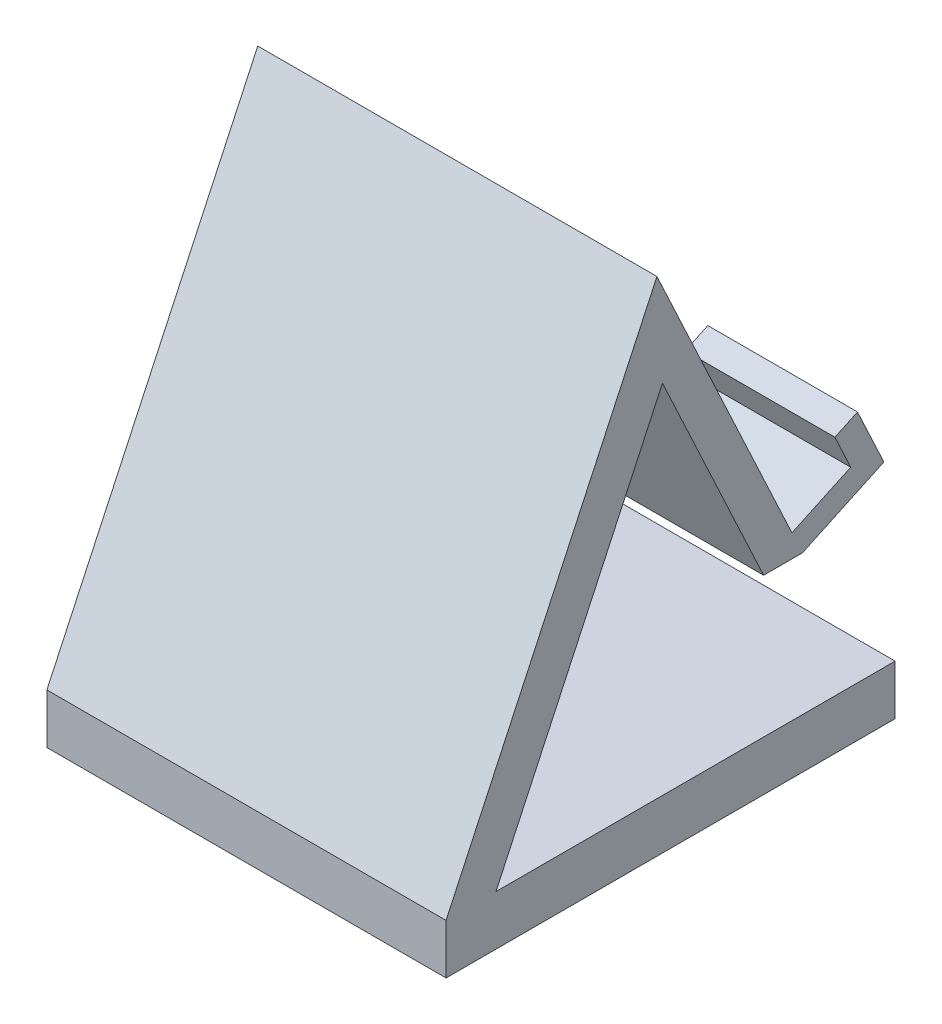
ISO-10303-21;
HEADER;
FILE_DESCRIPTION(('STEP AP214'),'2;1');
FILE_NAME('part.step','',(''),(''),'','','');
FILE_SCHEMA(('AUTOMOTIVE_DESIGN { 1 0 10303 214 1 1 1 1 }'));
ENDSEC;
DATA;
#1=APPLICATION_CONTEXT('core data for automotive mechanical design processes');
#2=APPLICATION_PROTOCOL_DEFINITION('international standard','automotive_design',2000,#1);
#3=PRODUCT_CONTEXT('',#1,'mechanical');
#4=PRODUCT('Part','Part','',(#3));
#5=PRODUCT_RELATED_PRODUCT_CATEGORY('part','',(#4));
#6=PRODUCT_DEFINITION_FORMATION('','',#4);
#7=PRODUCT_DEFINITION_CONTEXT('part definition',#1,'design');
#8=PRODUCT_DEFINITION('design','',#6,#7);
#9=PRODUCT_DEFINITION_SHAPE('','',#8);
#10=(LENGTH_UNIT() NAMED_UNIT(*) SI_UNIT(.MILLI.,.METRE.));
#11=(NAMED_UNIT(*) PLANE_ANGLE_UNIT() SI_UNIT($,.RADIAN.));
#12=(NAMED_UNIT(*) SI_UNIT($,.STERADIAN.) SOLID_ANGLE_UNIT());
#13=UNCERTAINTY_MEASURE_WITH_UNIT(LENGTH_MEASURE(1.E-05),#10,'distance_accuracy_value','');
#14=(GEOMETRIC_REPRESENTATION_CONTEXT(3) GLOBAL_UNCERTAINTY_ASSIGNED_CONTEXT((#13)) GLOBAL_UNIT_ASSIGNED_CONTEXT((#10,
#11,#12)) REPRESENTATION_CONTEXT('',''));
#15=CARTESIAN_POINT('',(0.,0.,0.));
#16=DIRECTION('',(0.,0.,1.));
#17=DIRECTION('',(1.,0.,0.));
#18=AXIS2_PLACEMENT_3D('',#15,#16,#17);
#19=CARTESIAN_POINT('',(80.,100.630778703665,-42.2618261740697));
#20=DIRECTION('',(0.,-0.422618261740698,0.906307787036651));
#21=DIRECTION('',(0.,-0.906307787036651,-0.422618261740698));
#22=AXIS2_PLACEMENT_3D('',#19,#20,#21);
#23=PLANE('',#22);
#24=DIRECTION('',(1.,0.,0.));
#25=VECTOR('',#24,1.);
#26=CARTESIAN_POINT('',(0.,42.6067091621437,-69.3188941585993));
#27=LINE('',#26,#25);
#28=CARTESIAN_POINT('',(0.,42.6067091621437,-69.3188941585993));
#29=VERTEX_POINT('',#28);
#30=CARTESIAN_POINT('',(30.,42.6067091621437,-69.3188941585993));
#31=VERTEX_POINT('',#30);
#32=EDGE_CURVE('E260',#29,#31,#27,.T.);
#33=ORIENTED_EDGE('',*,*,#32,.F.);
#34=DIRECTION('',(0.,0.90630778703665,0.422618261740698));
#35=VECTOR('',#34,1.);
#36=CARTESIAN_POINT('',(0.,100.630778703665,-42.2618261740697));
#37=LINE('',#36,#35);
#38=CARTESIAN_POINT('',(0.,100.630778703665,-42.2618261740697));
#39=VERTEX_POINT('',#38);
#40=EDGE_CURVE('E357',#29,#39,#37,.T.);
#41=ORIENTED_EDGE('',*,*,#40,.T.);
#42=DIRECTION('',(-1.,0.,0.));
#43=VECTOR('',#42,1.);
#44=CARTESIAN_POINT('',(80.,100.630778703665,-42.2618261740697));
#45=LINE('',#44,#43);
#46=CARTESIAN_POINT('',(80.,100.630778703665,-42.2618261740697));
#47=VERTEX_POINT('',#46);
#48=EDGE_CURVE('E365',#47,#39,#45,.T.);
#49=ORIENTED_EDGE('',*,*,#48,.F.);
#50=DIRECTION('',(0.,0.906307787036651,0.422618261740697));
#51=VECTOR('',#50,1.);
#52=CARTESIAN_POINT('',(80.,92.4536374491595,-46.0748897628608));
#53=LINE('',#52,#51);
#54=CARTESIAN_POINT('',(80.,42.6067091621437,-69.3188941585992));
#55=VERTEX_POINT('',#54);
#56=EDGE_CURVE('E329',#55,#47,#53,.T.);
#57=ORIENTED_EDGE('',*,*,#56,.F.);
#58=DIRECTION('',(1.,0.,0.));
#59=VECTOR('',#58,1.);
#60=CARTESIAN_POINT('',(80.,42.6067091621437,-69.3188941585993));
#61=LINE('',#60,#59);
#62=CARTESIAN_POINT('',(50.,42.6067091621437,-69.3188941585993));
#63=VERTEX_POINT('',#62);
#64=EDGE_CURVE('E285',#63,#55,#61,.T.);
#65=ORIENTED_EDGE('',*,*,#64,.F.);
#66=DIRECTION('',(0.,0.906307787036651,0.422618261740698));
#67=VECTOR('',#66,1.);
#68=CARTESIAN_POINT('',(50.,38.0751702269605,-71.4319854673028));
#69=LINE('',#68,#67);
#70=CARTESIAN_POINT('',(50.,38.0751702269605,-71.4319854673028));
#71=VERTEX_POINT('',#70);
#72=EDGE_CURVE('E279',#71,#63,#69,.T.);
#73=ORIENTED_EDGE('',*,*,#72,.F.);
#74=DIRECTION('',(-1.,0.,0.));
#75=VECTOR('',#74,1.);
#76=CARTESIAN_POINT('',(80.,38.0751702269604,-71.4319854673026));
#77=LINE('',#76,#75);
#78=CARTESIAN_POINT('',(30.,38.0751702269604,-71.4319854673026));
#79=VERTEX_POINT('',#78);
#80=EDGE_CURVE('E369',#71,#79,#77,.T.);
#81=ORIENTED_EDGE('',*,*,#80,.T.);
#82=DIRECTION('',(0.,-0.90630778703665,-0.422618261740698));
#83=VECTOR('',#82,1.);
#84=CARTESIAN_POINT('',(30.,38.0751702269605,-71.4319854673028));
#85=LINE('',#84,#83);
#86=EDGE_CURVE('E55',#31,#79,#85,.T.);
#87=ORIENTED_EDGE('',*,*,#86,.F.);
#88=EDGE_LOOP('',(#33,#41,#49,#57,#65,#73,#81,#87));
#89=FACE_BOUND('',#88,.T.);
#90=ADVANCED_FACE('F39',(#89),#23,.F.);
#91=CARTESIAN_POINT('',(80.,0.,0.));
#92=DIRECTION('',(0.,0.,-1.));
#93=DIRECTION('',(-1.,0.,0.));
#94=AXIS2_PLACEMENT_3D('',#91,#92,#93);
#95=PLANE('',#94);
#96=DIRECTION('',(0.,-1.,0.));
#97=VECTOR('',#96,1.);
#98=CARTESIAN_POINT('',(0.,0.,0.));
#99=LINE('',#98,#97);
#100=CARTESIAN_POINT('',(0.,10.,0.));
#101=VERTEX_POINT('',#100);
#102=CARTESIAN_POINT('',(0.,0.,0.));
#103=VERTEX_POINT('',#102);
#104=EDGE_CURVE('E304',#101,#103,#99,.T.);
#105=ORIENTED_EDGE('',*,*,#104,.T.);
#106=DIRECTION('',(-1.,0.,0.));
#107=VECTOR('',#106,1.);
#108=CARTESIAN_POINT('',(80.,0.,0.));
#109=LINE('',#108,#107);
#110=CARTESIAN_POINT('',(80.,0.,0.));
#111=VERTEX_POINT('',#110);
#112=EDGE_CURVE('E11',#111,#103,#109,.T.);
#113=ORIENTED_EDGE('',*,*,#112,.F.);
#114=DIRECTION('',(0.,-1.,0.));
#115=VECTOR('',#114,1.);
#116=CARTESIAN_POINT('',(80.,0.,0.));
#117=LINE('',#116,#115);
#118=CARTESIAN_POINT('',(80.,10.,0.));
#119=VERTEX_POINT('',#118);
#120=EDGE_CURVE('E305',#119,#111,#117,.T.);
#121=ORIENTED_EDGE('',*,*,#120,.F.);
#122=DIRECTION('',(-1.,0.,0.));
#123=VECTOR('',#122,1.);
#124=CARTESIAN_POINT('',(80.,10.,0.));
#125=LINE('',#124,#123);
#126=EDGE_CURVE('E335',#119,#101,#125,.T.);
#127=ORIENTED_EDGE('',*,*,#126,.T.);
#128=EDGE_LOOP('',(#105,#113,#121,#127));
#129=FACE_BOUND('',#128,.T.);
#130=ADVANCED_FACE('F41',(#129),#95,.F.);
#131=CARTESIAN_POINT('',(80.,0.,0.));
#132=DIRECTION('',(0.,1.,0.));
#133=DIRECTION('',(0.,0.,1.));
#134=AXIS2_PLACEMENT_3D('',#131,#132,#133);
#135=PLANE('',#134);
#136=DIRECTION('',(0.,0.,-1.));
#137=VECTOR('',#136,1.);
#138=CARTESIAN_POINT('',(0.,0.,0.));
#139=LINE('',#138,#137);
#140=CARTESIAN_POINT('',(0.,0.,-90.));
#141=VERTEX_POINT('',#140);
#142=EDGE_CURVE('E339',#103,#141,#139,.T.);
#143=ORIENTED_EDGE('',*,*,#142,.T.);
#144=DIRECTION('',(-1.,0.,0.));
#145=VECTOR('',#144,1.);
#146=CARTESIAN_POINT('',(80.,0.,-90.));
#147=LINE('',#146,#145);
#148=CARTESIAN_POINT('',(80.,0.,-90.));
#149=VERTEX_POINT('',#148);
#150=EDGE_CURVE('E48',#149,#141,#147,.T.);
#151=ORIENTED_EDGE('',*,*,#150,.F.);
#152=DIRECTION('',(0.,0.,-1.));
#153=VECTOR('',#152,1.);
#154=CARTESIAN_POINT('',(80.,0.,0.));
#155=LINE('',#154,#153);
#156=EDGE_CURVE('E309',#111,#149,#155,.T.);
#157=ORIENTED_EDGE('',*,*,#156,.F.);
#158=ORIENTED_EDGE('',*,*,#112,.T.);
#159=EDGE_LOOP('',(#143,#151,#157,#158));
#160=FACE_BOUND('',#159,.T.);
#161=ADVANCED_FACE('F417',(#160),#135,.F.);
#162=CARTESIAN_POINT('',(80.,0.,-90.));
#163=DIRECTION('',(0.,0.,1.));
#164=DIRECTION('',(1.,0.,0.));
#165=AXIS2_PLACEMENT_3D('',#162,#163,#164);
#166=PLANE('',#165);
#167=DIRECTION('',(0.,1.,0.));
#168=VECTOR('',#167,1.);
#169=CARTESIAN_POINT('',(0.,0.,-90.));
#170=LINE('',#169,#168);
#171=CARTESIAN_POINT('',(0.,10.,-90.));
#172=VERTEX_POINT('',#171);
#173=EDGE_CURVE('E342',#141,#172,#170,.T.);
#174=ORIENTED_EDGE('',*,*,#173,.T.);
#175=DIRECTION('',(-1.,0.,0.));
#176=VECTOR('',#175,1.);
#177=CARTESIAN_POINT('',(80.,10.,-90.));
#178=LINE('',#177,#176);
#179=CARTESIAN_POINT('',(80.,10.,-90.));
#180=VERTEX_POINT('',#179);
#181=EDGE_CURVE('E385',#180,#172,#178,.T.);
#182=ORIENTED_EDGE('',*,*,#181,.F.);
#183=DIRECTION('',(0.,1.,0.));
#184=VECTOR('',#183,1.);
#185=CARTESIAN_POINT('',(80.,0.,-90.));
#186=LINE('',#185,#184);
#187=EDGE_CURVE('E313',#149,#180,#186,.T.);
#188=ORIENTED_EDGE('',*,*,#187,.F.);
#189=ORIENTED_EDGE('',*,*,#150,.T.);
#190=EDGE_LOOP('',(#174,#182,#188,#189));
#191=FACE_BOUND('',#190,.T.);
#192=ADVANCED_FACE('F394',(#191),#166,.F.);
#193=CARTESIAN_POINT('',(80.,10.,-10.));
#194=DIRECTION('',(0.,-1.,0.));
#195=DIRECTION('',(0.,0.,-1.));
#196=AXIS2_PLACEMENT_3D('',#193,#194,#195);
#197=PLANE('',#196);
#198=DIRECTION('',(0.,0.,1.));
#199=VECTOR('',#198,1.);
#200=CARTESIAN_POINT('',(0.,10.,-10.));
#201=LINE('',#200,#199);
#202=CARTESIAN_POINT('',(0.,10.,-10.));
#203=VERTEX_POINT('',#202);
#204=EDGE_CURVE('E345',#172,#203,#201,.T.);
#205=ORIENTED_EDGE('',*,*,#204,.T.);
#206=DIRECTION('',(-1.,0.,0.));
#207=VECTOR('',#206,1.);
#208=CARTESIAN_POINT('',(80.,10.,-10.));
#209=LINE('',#208,#207);
#210=CARTESIAN_POINT('',(80.,10.,-10.));
#211=VERTEX_POINT('',#210);
#212=EDGE_CURVE('E381',#211,#203,#209,.T.);
#213=ORIENTED_EDGE('',*,*,#212,.F.);
#214=DIRECTION('',(0.,0.,1.));
#215=VECTOR('',#214,1.);
#216=CARTESIAN_POINT('',(80.,10.,-10.));
#217=LINE('',#216,#215);
#218=EDGE_CURVE('E316',#180,#211,#217,.T.);
#219=ORIENTED_EDGE('',*,*,#218,.F.);
#220=ORIENTED_EDGE('',*,*,#181,.T.);
#221=EDGE_LOOP('',(#205,#213,#219,#220));
#222=FACE_BOUND('',#221,.T.);
#223=ADVANCED_FACE('F405',(#222),#197,.F.);
#224=CARTESIAN_POINT('',(80.,10.,-10.));
#225=DIRECTION('',(0.,0.422618261740697,0.906307787036651));
#226=DIRECTION('',(0.,-0.906307787036651,0.422618261740697));
#227=AXIS2_PLACEMENT_3D('',#224,#225,#226);
#228=PLANE('',#227);
#229=DIRECTION('',(0.,0.906307787036651,-0.422618261740697));
#230=VECTOR('',#229,1.);
#231=CARTESIAN_POINT('',(0.,10.,-10.));
#232=LINE('',#231,#230);
#233=CARTESIAN_POINT('',(0.,81.5596823642886,-43.3688279016068));
#234=VERTEX_POINT('',#233);
#235=EDGE_CURVE('E348',#203,#234,#232,.T.);
#236=ORIENTED_EDGE('',*,*,#235,.T.);
#237=DIRECTION('',(-1.,0.,0.));
#238=VECTOR('',#237,1.);
#239=CARTESIAN_POINT('',(80.,81.5596823642886,-43.3688279016068));
#240=LINE('',#239,#238);
#241=CARTESIAN_POINT('',(80.,81.5596823642886,-43.3688279016068));
#242=VERTEX_POINT('',#241);
#243=EDGE_CURVE('E377',#242,#234,#240,.T.);
#244=ORIENTED_EDGE('',*,*,#243,.F.);
#245=DIRECTION('',(0.,0.906307787036651,-0.422618261740697));
#246=VECTOR('',#245,1.);
#247=CARTESIAN_POINT('',(80.,10.,-10.));
#248=LINE('',#247,#246);
#249=EDGE_CURVE('E319',#211,#242,#248,.T.);
#250=ORIENTED_EDGE('',*,*,#249,.F.);
#251=ORIENTED_EDGE('',*,*,#212,.T.);
#252=EDGE_LOOP('',(#236,#244,#250,#251));
#253=FACE_BOUND('',#252,.T.);
#254=ADVANCED_FACE('F409',(#253),#228,.F.);
#255=CARTESIAN_POINT('',(80.,81.5596823642886,-43.3688279016068));
#256=DIRECTION('',(0.,0.422618261740697,-0.906307787036651));
#257=DIRECTION('',(0.,0.906307787036651,0.422618261740697));
#258=AXIS2_PLACEMENT_3D('',#255,#256,#257);
#259=PLANE('',#258);
#260=DIRECTION('',(0.,-0.906307787036651,-0.422618261740697));
#261=VECTOR('',#260,1.);
#262=CARTESIAN_POINT('',(0.,81.5596823642886,-43.3688279016068));
#263=LINE('',#262,#261);
#264=CARTESIAN_POINT('',(0.,38.0751702269604,-63.6459889223767));
#265=VERTEX_POINT('',#264);
#266=EDGE_CURVE('E351',#234,#265,#263,.T.);
#267=ORIENTED_EDGE('',*,*,#266,.T.);
#268=DIRECTION('',(-1.,0.,0.));
#269=VECTOR('',#268,1.);
#270=CARTESIAN_POINT('',(80.,38.0751702269604,-63.6459889223767));
#271=LINE('',#270,#269);
#272=CARTESIAN_POINT('',(80.,38.0751702269604,-63.6459889223767));
#273=VERTEX_POINT('',#272);
#274=EDGE_CURVE('E373',#273,#265,#271,.T.);
#275=ORIENTED_EDGE('',*,*,#274,.F.);
#276=DIRECTION('',(0.,-0.906307787036651,-0.422618261740697));
#277=VECTOR('',#276,1.);
#278=CARTESIAN_POINT('',(80.,81.5596823642886,-43.3688279016068));
#279=LINE('',#278,#277);
#280=EDGE_CURVE('E322',#242,#273,#279,.T.);
#281=ORIENTED_EDGE('',*,*,#280,.F.);
#282=ORIENTED_EDGE('',*,*,#243,.T.);
#283=EDGE_LOOP('',(#267,#275,#281,#282));
#284=FACE_BOUND('',#283,.T.);
#285=ADVANCED_FACE('F461',(#284),#259,.F.);
#286=CARTESIAN_POINT('',(80.,38.0751702269604,-63.6459889223767));
#287=DIRECTION('',(0.,1.,0.));
#288=DIRECTION('',(0.,0.,1.));
#289=AXIS2_PLACEMENT_3D('',#286,#287,#288);
#290=PLANE('',#289);
#291=DIRECTION('',(0.,0.,-1.));
#292=VECTOR('',#291,1.);
#293=CARTESIAN_POINT('',(0.,38.0751702269604,-63.6459889223767));
#294=LINE('',#293,#292);
#295=CARTESIAN_POINT('',(0.,38.0751702269604,-71.4319854673026));
#296=VERTEX_POINT('',#295);
#297=EDGE_CURVE('E354',#265,#296,#294,.T.);
#298=ORIENTED_EDGE('',*,*,#297,.T.);
#299=DIRECTION('',(-1.,0.,0.));
#300=VECTOR('',#299,1.);
#301=CARTESIAN_POINT('',(0.,38.0751702269605,-71.4319854673028));
#302=LINE('',#301,#300);
#303=EDGE_CURVE('E63',#79,#296,#302,.T.);
#304=ORIENTED_EDGE('',*,*,#303,.F.);
#305=ORIENTED_EDGE('',*,*,#80,.F.);
#306=CARTESIAN_POINT('',(80.,38.0751702269605,-71.4319854673028));
#307=VERTEX_POINT('',#306);
#308=EDGE_CURVE('E370',#307,#71,#77,.T.);
#309=ORIENTED_EDGE('',*,*,#308,.F.);
#310=DIRECTION('',(0.,0.,-1.));
#311=VECTOR('',#310,1.);
#312=CARTESIAN_POINT('',(80.,38.0751702269604,-63.6459889223767));
#313=LINE('',#312,#311);
#314=EDGE_CURVE('E325',#273,#307,#313,.T.);
#315=ORIENTED_EDGE('',*,*,#314,.F.);
#316=ORIENTED_EDGE('',*,*,#274,.T.);
#317=EDGE_LOOP('',(#298,#304,#305,#309,#315,#316));
#318=FACE_BOUND('',#317,.T.);
#319=ADVANCED_FACE('F458',(#318),#290,.F.);
#320=CARTESIAN_POINT('',(80.,10.,0.));
#321=DIRECTION('',(0.,-0.422618261740697,-0.906307787036651));
#322=DIRECTION('',(0.,0.906307787036651,-0.422618261740697));
#323=AXIS2_PLACEMENT_3D('',#320,#321,#322);
#324=PLANE('',#323);
#325=DIRECTION('',(0.,-0.906307787036651,0.422618261740697));
#326=VECTOR('',#325,1.);
#327=CARTESIAN_POINT('',(0.,10.,0.));
#328=LINE('',#327,#326);
#329=EDGE_CURVE('E310',#39,#101,#328,.T.);
#330=ORIENTED_EDGE('',*,*,#329,.T.);
#331=ORIENTED_EDGE('',*,*,#126,.F.);
#332=DIRECTION('',(0.,-0.906307787036651,0.422618261740697));
#333=VECTOR('',#332,1.);
#334=CARTESIAN_POINT('',(80.,10.,0.));
#335=LINE('',#334,#333);
#336=EDGE_CURVE('E332',#47,#119,#335,.T.);
#337=ORIENTED_EDGE('',*,*,#336,.F.);
#338=ORIENTED_EDGE('',*,*,#48,.T.);
#339=EDGE_LOOP('',(#330,#331,#337,#338));
#340=FACE_BOUND('',#339,.T.);
#341=ADVANCED_FACE('F422',(#340),#324,.F.);
#342=CARTESIAN_POINT('',(80.,0.,0.));
#343=DIRECTION('',(-1.,0.,0.));
#344=DIRECTION('',(0.,0.,1.));
#345=AXIS2_PLACEMENT_3D('',#342,#343,#344);
#346=PLANE('',#345);
#347=ORIENTED_EDGE('',*,*,#120,.T.);
#348=ORIENTED_EDGE('',*,*,#156,.T.);
#349=ORIENTED_EDGE('',*,*,#187,.T.);
#350=ORIENTED_EDGE('',*,*,#218,.T.);
#351=ORIENTED_EDGE('',*,*,#249,.T.);
#352=ORIENTED_EDGE('',*,*,#280,.T.);
#353=ORIENTED_EDGE('',*,*,#314,.T.);
#354=DIRECTION('',(0.,-0.422618261740698,0.906307787036651));
#355=VECTOR('',#354,1.);
#356=CARTESIAN_POINT('',(80.,43.5692076295895,-83.2139866987792));
#357=LINE('',#356,#355);
#358=CARTESIAN_POINT('',(80.,45.6822989382931,-87.7455256339625));
#359=VERTEX_POINT('',#358);
#360=EDGE_CURVE('E301',#359,#307,#357,.T.);
#361=ORIENTED_EDGE('',*,*,#360,.F.);
#362=DIRECTION('',(0.,-0.906307787036651,-0.422618261740697));
#363=VECTOR('',#362,1.);
#364=CARTESIAN_POINT('',(80.,45.6822989382931,-87.7455256339625));
#365=LINE('',#364,#363);
#366=CARTESIAN_POINT('',(80.,57.0111462762512,-82.4627973622038));
#367=VERTEX_POINT('',#366);
#368=EDGE_CURVE('E229',#367,#359,#365,.T.);
#369=ORIENTED_EDGE('',*,*,#368,.F.);
#370=DIRECTION('',(0.,-0.422618261740698,0.906307787036651));
#371=VECTOR('',#370,1.);
#372=CARTESIAN_POINT('',(80.,57.0111462762512,-82.4627973622038));
#373=LINE('',#372,#371);
#374=CARTESIAN_POINT('',(80.,54.8980549675477,-77.9312584270205));
#375=VERTEX_POINT('',#374);
#376=EDGE_CURVE('E244',#367,#375,#373,.T.);
#377=ORIENTED_EDGE('',*,*,#376,.T.);
#378=DIRECTION('',(0.,-0.906307787036651,-0.422618261740697));
#379=VECTOR('',#378,1.);
#380=CARTESIAN_POINT('',(80.,43.5692076295896,-83.2139866987792));
#381=LINE('',#380,#379);
#382=CARTESIAN_POINT('',(80.,48.1007465647728,-81.1008953900757));
#383=VERTEX_POINT('',#382);
#384=EDGE_CURVE('E228',#375,#383,#381,.T.);
#385=ORIENTED_EDGE('',*,*,#384,.T.);
#386=DIRECTION('',(0.,-0.422618261740698,0.906307787036651));
#387=VECTOR('',#386,1.);
#388=CARTESIAN_POINT('',(80.,48.1007465647728,-81.1008953900757));
#389=LINE('',#388,#387);
#390=EDGE_CURVE('E284',#383,#55,#389,.T.);
#391=ORIENTED_EDGE('',*,*,#390,.T.);
#392=ORIENTED_EDGE('',*,*,#56,.T.);
#393=ORIENTED_EDGE('',*,*,#336,.T.);
#394=EDGE_LOOP('',(#347,#348,#349,#350,#351,#352,#353,#361,#369,#377,#385,#391,#392,#393));
#395=FACE_BOUND('',#394,.T.);
#396=ADVANCED_FACE('F413',(#395),#346,.F.);
#397=CARTESIAN_POINT('',(0.,0.,0.));
#398=DIRECTION('',(-1.,0.,0.));
#399=DIRECTION('',(0.,0.,1.));
#400=AXIS2_PLACEMENT_3D('',#397,#398,#399);
#401=PLANE('',#400);
#402=ORIENTED_EDGE('',*,*,#104,.F.);
#403=ORIENTED_EDGE('',*,*,#329,.F.);
#404=ORIENTED_EDGE('',*,*,#40,.F.);
#405=DIRECTION('',(0.,-0.422618261740698,0.906307787036651));
#406=VECTOR('',#405,1.);
#407=CARTESIAN_POINT('',(0.,48.1007465647728,-81.1008953900757));
#408=LINE('',#407,#406);
#409=CARTESIAN_POINT('',(0.,48.1007465647728,-81.1008953900757));
#410=VERTEX_POINT('',#409);
#411=EDGE_CURVE('E275',#410,#29,#408,.T.);
#412=ORIENTED_EDGE('',*,*,#411,.F.);
#413=DIRECTION('',(0.,0.906307787036651,0.422618261740697));
#414=VECTOR('',#413,1.);
#415=CARTESIAN_POINT('',(0.,43.5692076295896,-83.2139866987792));
#416=LINE('',#415,#414);
#417=CARTESIAN_POINT('',(0.,54.8980549675477,-77.9312584270205));
#418=VERTEX_POINT('',#417);
#419=EDGE_CURVE('E208',#410,#418,#416,.T.);
#420=ORIENTED_EDGE('',*,*,#419,.T.);
#421=DIRECTION('',(0.,-0.422618261740698,0.906307787036651));
#422=VECTOR('',#421,1.);
#423=CARTESIAN_POINT('',(0.,57.0111462762512,-82.4627973622038));
#424=LINE('',#423,#422);
#425=CARTESIAN_POINT('',(0.,57.0111462762512,-82.4627973622038));
#426=VERTEX_POINT('',#425);
#427=EDGE_CURVE('E224',#426,#418,#424,.T.);
#428=ORIENTED_EDGE('',*,*,#427,.F.);
#429=DIRECTION('',(0.,0.906307787036651,0.422618261740697));
#430=VECTOR('',#429,1.);
#431=CARTESIAN_POINT('',(0.,45.6822989382931,-87.7455256339625));
#432=LINE('',#431,#430);
#433=CARTESIAN_POINT('',(0.,45.6822989382931,-87.7455256339625));
#434=VERTEX_POINT('',#433);
#435=EDGE_CURVE('E198',#434,#426,#432,.T.);
#436=ORIENTED_EDGE('',*,*,#435,.F.);
#437=DIRECTION('',(0.,-0.422618261740698,0.906307787036651));
#438=VECTOR('',#437,1.);
#439=CARTESIAN_POINT('',(0.,43.5692076295895,-83.2139866987792));
#440=LINE('',#439,#438);
#441=EDGE_CURVE('E189',#434,#296,#440,.T.);
#442=ORIENTED_EDGE('',*,*,#441,.T.);
#443=ORIENTED_EDGE('',*,*,#297,.F.);
#444=ORIENTED_EDGE('',*,*,#266,.F.);
#445=ORIENTED_EDGE('',*,*,#235,.F.);
#446=ORIENTED_EDGE('',*,*,#204,.F.);
#447=ORIENTED_EDGE('',*,*,#173,.F.);
#448=ORIENTED_EDGE('',*,*,#142,.F.);
#449=EDGE_LOOP('',(#402,#403,#404,#412,#420,#428,#436,#442,#443,#444,#445,#446,#447,#448));
#450=FACE_BOUND('',#449,.T.);
#451=ADVANCED_FACE('F400',(#450),#401,.T.);
#452=CARTESIAN_POINT('',(80.,43.5692076295895,-83.2139866987792));
#453=DIRECTION('',(0.,0.906307787036651,0.422618261740698));
#454=DIRECTION('',(0.,-0.422618261740698,0.906307787036651));
#455=AXIS2_PLACEMENT_3D('',#452,#453,#454);
#456=PLANE('',#455);
#457=ORIENTED_EDGE('',*,*,#308,.T.);
#458=DIRECTION('',(0.,-0.422618261740698,0.906307787036651));
#459=VECTOR('',#458,1.);
#460=CARTESIAN_POINT('',(50.,43.5692076295895,-83.2139866987792));
#461=LINE('',#460,#459);
#462=CARTESIAN_POINT('',(50.,45.6822989382931,-87.7455256339625));
#463=VERTEX_POINT('',#462);
#464=EDGE_CURVE('E297',#463,#71,#461,.T.);
#465=ORIENTED_EDGE('',*,*,#464,.F.);
#466=DIRECTION('',(-1.,0.,0.));
#467=VECTOR('',#466,1.);
#468=CARTESIAN_POINT('',(80.,45.6822989382931,-87.7455256339625));
#469=LINE('',#468,#467);
#470=EDGE_CURVE('E233',#359,#463,#469,.T.);
#471=ORIENTED_EDGE('',*,*,#470,.F.);
#472=ORIENTED_EDGE('',*,*,#360,.T.);
#473=EDGE_LOOP('',(#457,#465,#471,#472));
#474=FACE_BOUND('',#473,.T.);
#475=ADVANCED_FACE('F512',(#474),#456,.F.);
#476=CARTESIAN_POINT('',(50.,43.5692076295895,-83.2139866987792));
#477=DIRECTION('',(1.,0.,0.));
#478=DIRECTION('',(0.,0.,-1.));
#479=AXIS2_PLACEMENT_3D('',#476,#477,#478);
#480=PLANE('',#479);
#481=ORIENTED_EDGE('',*,*,#72,.T.);
#482=DIRECTION('',(0.,-0.422618261740698,0.906307787036651));
#483=VECTOR('',#482,1.);
#484=CARTESIAN_POINT('',(50.,48.1007465647728,-81.1008953900757));
#485=LINE('',#484,#483);
#486=CARTESIAN_POINT('',(50.,48.1007465647728,-81.1008953900757));
#487=VERTEX_POINT('',#486);
#488=EDGE_CURVE('E293',#487,#63,#485,.T.);
#489=ORIENTED_EDGE('',*,*,#488,.F.);
#490=DIRECTION('',(0.,0.906307787036651,0.422618261740697));
#491=VECTOR('',#490,1.);
#492=CARTESIAN_POINT('',(50.,43.5692076295896,-83.2139866987792));
#493=LINE('',#492,#491);
#494=CARTESIAN_POINT('',(50.,54.8980549675477,-77.9312584270205));
#495=VERTEX_POINT('',#494);
#496=EDGE_CURVE('E248',#487,#495,#493,.T.);
#497=ORIENTED_EDGE('',*,*,#496,.T.);
#498=DIRECTION('',(0.,-0.422618261740698,0.906307787036651));
#499=VECTOR('',#498,1.);
#500=CARTESIAN_POINT('',(50.,57.0111462762512,-82.4627973622038));
#501=LINE('',#500,#499);
#502=CARTESIAN_POINT('',(50.,57.0111462762512,-82.4627973622038));
#503=VERTEX_POINT('',#502);
#504=EDGE_CURVE('E256',#503,#495,#501,.T.);
#505=ORIENTED_EDGE('',*,*,#504,.F.);
#506=DIRECTION('',(0.,0.906307787036651,0.422618261740697));
#507=VECTOR('',#506,1.);
#508=CARTESIAN_POINT('',(50.,45.6822989382931,-87.7455256339625));
#509=LINE('',#508,#507);
#510=EDGE_CURVE('E238',#463,#503,#509,.T.);
#511=ORIENTED_EDGE('',*,*,#510,.F.);
#512=ORIENTED_EDGE('',*,*,#464,.T.);
#513=EDGE_LOOP('',(#481,#489,#497,#505,#511,#512));
#514=FACE_BOUND('',#513,.T.);
#515=ADVANCED_FACE('F518',(#514),#480,.F.);
#516=CARTESIAN_POINT('',(80.,48.1007465647728,-81.1008953900757));
#517=DIRECTION('',(0.,-0.906307787036651,-0.422618261740698));
#518=DIRECTION('',(0.,0.422618261740698,-0.906307787036651));
#519=AXIS2_PLACEMENT_3D('',#516,#517,#518);
#520=PLANE('',#519);
#521=ORIENTED_EDGE('',*,*,#64,.T.);
#522=ORIENTED_EDGE('',*,*,#390,.F.);
#523=DIRECTION('',(1.,0.,0.));
#524=VECTOR('',#523,1.);
#525=CARTESIAN_POINT('',(80.,48.1007465647728,-81.1008953900757));
#526=LINE('',#525,#524);
#527=EDGE_CURVE('E280',#487,#383,#526,.T.);
#528=ORIENTED_EDGE('',*,*,#527,.F.);
#529=ORIENTED_EDGE('',*,*,#488,.T.);
#530=EDGE_LOOP('',(#521,#522,#528,#529));
#531=FACE_BOUND('',#530,.T.);
#532=ADVANCED_FACE('F526',(#531),#520,.F.);
#533=CARTESIAN_POINT('',(0.,48.1007465647728,-81.1008953900757));
#534=DIRECTION('',(0.,-0.906307787036651,-0.422618261740698));
#535=DIRECTION('',(0.,0.422618261740698,-0.906307787036651));
#536=AXIS2_PLACEMENT_3D('',#533,#534,#535);
#537=PLANE('',#536);
#538=ORIENTED_EDGE('',*,*,#32,.T.);
#539=DIRECTION('',(0.,-0.422618261740698,0.906307787036651));
#540=VECTOR('',#539,1.);
#541=CARTESIAN_POINT('',(30.,48.1007465647728,-81.1008953900757));
#542=LINE('',#541,#540);
#543=CARTESIAN_POINT('',(30.,48.1007465647728,-81.1008953900757));
#544=VERTEX_POINT('',#543);
#545=EDGE_CURVE('E188',#544,#31,#542,.T.);
#546=ORIENTED_EDGE('',*,*,#545,.F.);
#547=DIRECTION('',(1.,0.,0.));
#548=VECTOR('',#547,1.);
#549=CARTESIAN_POINT('',(0.,48.1007465647728,-81.1008953900757));
#550=LINE('',#549,#548);
#551=EDGE_CURVE('E261',#410,#544,#550,.T.);
#552=ORIENTED_EDGE('',*,*,#551,.F.);
#553=ORIENTED_EDGE('',*,*,#411,.T.);
#554=EDGE_LOOP('',(#538,#546,#552,#553));
#555=FACE_BOUND('',#554,.T.);
#556=ADVANCED_FACE('F429',(#555),#537,.F.);
#557=CARTESIAN_POINT('',(30.,43.5692076295895,-83.2139866987792));
#558=DIRECTION('',(-1.,0.,0.));
#559=DIRECTION('',(0.,0.,1.));
#560=AXIS2_PLACEMENT_3D('',#557,#558,#559);
#561=PLANE('',#560);
#562=ORIENTED_EDGE('',*,*,#86,.T.);
#563=DIRECTION('',(0.,-0.422618261740698,0.906307787036651));
#564=VECTOR('',#563,1.);
#565=CARTESIAN_POINT('',(30.,43.5692076295895,-83.2139866987792));
#566=LINE('',#565,#564);
#567=CARTESIAN_POINT('',(30.,45.6822989382931,-87.7455256339625));
#568=VERTEX_POINT('',#567);
#569=EDGE_CURVE('E179',#568,#79,#566,.T.);
#570=ORIENTED_EDGE('',*,*,#569,.F.);
#571=DIRECTION('',(0.,-0.906307787036651,-0.422618261740697));
#572=VECTOR('',#571,1.);
#573=CARTESIAN_POINT('',(30.,45.6822989382931,-87.7455256339625));
#574=LINE('',#573,#572);
#575=CARTESIAN_POINT('',(30.,57.0111462762512,-82.4627973622038));
#576=VERTEX_POINT('',#575);
#577=EDGE_CURVE('E184',#576,#568,#574,.T.);
#578=ORIENTED_EDGE('',*,*,#577,.F.);
#579=DIRECTION('',(0.,-0.422618261740698,0.906307787036651));
#580=VECTOR('',#579,1.);
#581=CARTESIAN_POINT('',(30.,57.0111462762512,-82.4627973622038));
#582=LINE('',#581,#580);
#583=CARTESIAN_POINT('',(30.,54.8980549675477,-77.9312584270205));
#584=VERTEX_POINT('',#583);
#585=EDGE_CURVE('E215',#576,#584,#582,.T.);
#586=ORIENTED_EDGE('',*,*,#585,.T.);
#587=DIRECTION('',(0.,-0.906307787036651,-0.422618261740697));
#588=VECTOR('',#587,1.);
#589=CARTESIAN_POINT('',(30.,43.5692076295896,-83.2139866987792));
#590=LINE('',#589,#588);
#591=EDGE_CURVE('E216',#584,#544,#590,.T.);
#592=ORIENTED_EDGE('',*,*,#591,.T.);
#593=ORIENTED_EDGE('',*,*,#545,.T.);
#594=EDGE_LOOP('',(#562,#570,#578,#586,#592,#593));
#595=FACE_BOUND('',#594,.T.);
#596=ADVANCED_FACE('F181',(#595),#561,.F.);
#597=CARTESIAN_POINT('',(0.,43.5692076295895,-83.2139866987792));
#598=DIRECTION('',(0.,0.906307787036651,0.422618261740698));
#599=DIRECTION('',(0.,-0.422618261740698,0.906307787036651));
#600=AXIS2_PLACEMENT_3D('',#597,#598,#599);
#601=PLANE('',#600);
#602=ORIENTED_EDGE('',*,*,#303,.T.);
#603=ORIENTED_EDGE('',*,*,#441,.F.);
#604=DIRECTION('',(-1.,0.,0.));
#605=VECTOR('',#604,1.);
#606=CARTESIAN_POINT('',(30.,45.6822989382931,-87.7455256339625));
#607=LINE('',#606,#605);
#608=EDGE_CURVE('E192',#568,#434,#607,.T.);
#609=ORIENTED_EDGE('',*,*,#608,.F.);
#610=ORIENTED_EDGE('',*,*,#569,.T.);
#611=EDGE_LOOP('',(#602,#603,#609,#610));
#612=FACE_BOUND('',#611,.T.);
#613=ADVANCED_FACE('F193',(#612),#601,.F.);
#614=CARTESIAN_POINT('',(0.,39.6545364509026,-85.0394278485596));
#615=DIRECTION('',(0.,-0.422618261740697,0.906307787036651));
#616=DIRECTION('',(0.,-0.906307787036651,-0.422618261740697));
#617=AXIS2_PLACEMENT_3D('',#614,#615,#616);
#618=PLANE('',#617);
#619=ORIENTED_EDGE('',*,*,#527,.T.);
#620=ORIENTED_EDGE('',*,*,#384,.F.);
#621=DIRECTION('',(1.,0.,0.));
#622=VECTOR('',#621,1.);
#623=CARTESIAN_POINT('',(80.,54.8980549675477,-77.9312584270205));
#624=LINE('',#623,#622);
#625=EDGE_CURVE('E234',#495,#375,#624,.T.);
#626=ORIENTED_EDGE('',*,*,#625,.F.);
#627=ORIENTED_EDGE('',*,*,#496,.F.);
#628=EDGE_LOOP('',(#619,#620,#626,#627));
#629=FACE_BOUND('',#628,.T.);
#630=ADVANCED_FACE('F553',(#629),#618,.T.);
#631=CARTESIAN_POINT('',(80.,57.0111462762512,-82.4627973622038));
#632=DIRECTION('',(0.,-0.906307787036651,-0.422618261740698));
#633=DIRECTION('',(0.,0.422618261740698,-0.906307787036651));
#634=AXIS2_PLACEMENT_3D('',#631,#632,#633);
#635=PLANE('',#634);
#636=ORIENTED_EDGE('',*,*,#625,.T.);
#637=ORIENTED_EDGE('',*,*,#376,.F.);
#638=DIRECTION('',(1.,0.,0.));
#639=VECTOR('',#638,1.);
#640=CARTESIAN_POINT('',(80.,57.0111462762512,-82.4627973622038));
#641=LINE('',#640,#639);
#642=EDGE_CURVE('E241',#503,#367,#641,.T.);
#643=ORIENTED_EDGE('',*,*,#642,.F.);
#644=ORIENTED_EDGE('',*,*,#504,.T.);
#645=EDGE_LOOP('',(#636,#637,#643,#644));
#646=FACE_BOUND('',#645,.T.);
#647=ADVANCED_FACE('F446',(#646),#635,.F.);
#648=CARTESIAN_POINT('',(0.,41.7676277596061,-89.5709667837429));
#649=DIRECTION('',(0.,-0.422618261740697,0.906307787036651));
#650=DIRECTION('',(0.,-0.906307787036651,-0.422618261740697));
#651=AXIS2_PLACEMENT_3D('',#648,#649,#650);
#652=PLANE('',#651);
#653=ORIENTED_EDGE('',*,*,#368,.T.);
#654=ORIENTED_EDGE('',*,*,#470,.T.);
#655=ORIENTED_EDGE('',*,*,#510,.T.);
#656=ORIENTED_EDGE('',*,*,#642,.T.);
#657=EDGE_LOOP('',(#653,#654,#655,#656));
#658=FACE_BOUND('',#657,.T.);
#659=ADVANCED_FACE('F439',(#658),#652,.F.);
#660=CARTESIAN_POINT('',(0.,39.6545364509026,-85.0394278485596));
#661=DIRECTION('',(0.,-0.422618261740697,0.906307787036651));
#662=DIRECTION('',(0.,-0.906307787036651,-0.422618261740697));
#663=AXIS2_PLACEMENT_3D('',#660,#661,#662);
#664=PLANE('',#663);
#665=ORIENTED_EDGE('',*,*,#551,.T.);
#666=ORIENTED_EDGE('',*,*,#591,.F.);
#667=DIRECTION('',(1.,0.,0.));
#668=VECTOR('',#667,1.);
#669=CARTESIAN_POINT('',(30.,54.8980549675477,-77.9312584270205));
#670=LINE('',#669,#668);
#671=EDGE_CURVE('E205',#418,#584,#670,.T.);
#672=ORIENTED_EDGE('',*,*,#671,.F.);
#673=ORIENTED_EDGE('',*,*,#419,.F.);
#674=EDGE_LOOP('',(#665,#666,#672,#673));
#675=FACE_BOUND('',#674,.T.);
#676=ADVANCED_FACE('F437',(#675),#664,.T.);
#677=CARTESIAN_POINT('',(30.,57.0111462762512,-82.4627973622038));
#678=DIRECTION('',(0.,-0.906307787036651,-0.422618261740698));
#679=DIRECTION('',(0.,0.422618261740698,-0.906307787036651));
#680=AXIS2_PLACEMENT_3D('',#677,#678,#679);
#681=PLANE('',#680);
#682=ORIENTED_EDGE('',*,*,#671,.T.);
#683=ORIENTED_EDGE('',*,*,#585,.F.);
#684=DIRECTION('',(1.,0.,0.));
#685=VECTOR('',#684,1.);
#686=CARTESIAN_POINT('',(30.,57.0111462762512,-82.4627973622038));
#687=LINE('',#686,#685);
#688=EDGE_CURVE('E202',#426,#576,#687,.T.);
#689=ORIENTED_EDGE('',*,*,#688,.F.);
#690=ORIENTED_EDGE('',*,*,#427,.T.);
#691=EDGE_LOOP('',(#682,#683,#689,#690));
#692=FACE_BOUND('',#691,.T.);
#693=ADVANCED_FACE('F435',(#692),#681,.F.);
#694=CARTESIAN_POINT('',(0.,41.7676277596061,-89.5709667837429));
#695=DIRECTION('',(0.,-0.422618261740697,0.906307787036651));
#696=DIRECTION('',(0.,-0.906307787036651,-0.422618261740697));
#697=AXIS2_PLACEMENT_3D('',#694,#695,#696);
#698=PLANE('',#697);
#699=ORIENTED_EDGE('',*,*,#577,.T.);
#700=ORIENTED_EDGE('',*,*,#608,.T.);
#701=ORIENTED_EDGE('',*,*,#435,.T.);
#702=ORIENTED_EDGE('',*,*,#688,.T.);
#703=EDGE_LOOP('',(#699,#700,#701,#702));
#704=FACE_BOUND('',#703,.T.);
#705=ADVANCED_FACE('F200',(#704),#698,.F.);
#706=CLOSED_SHELL('',(#90,#130,#161,#192,#223,#254,#285,#319,#341,#396,#451,#475,#515,#532,#556,
#596,#613,#630,#647,#659,#676,#693,#705));
#707=MANIFOLD_SOLID_BREP('B2',#706);
#708=ADVANCED_BREP_SHAPE_REPRESENTATION('',(#18,#707),#14);
#709=SHAPE_DEFINITION_REPRESENTATION(#9,#708);
ENDSEC;
END-ISO-10303-21;
